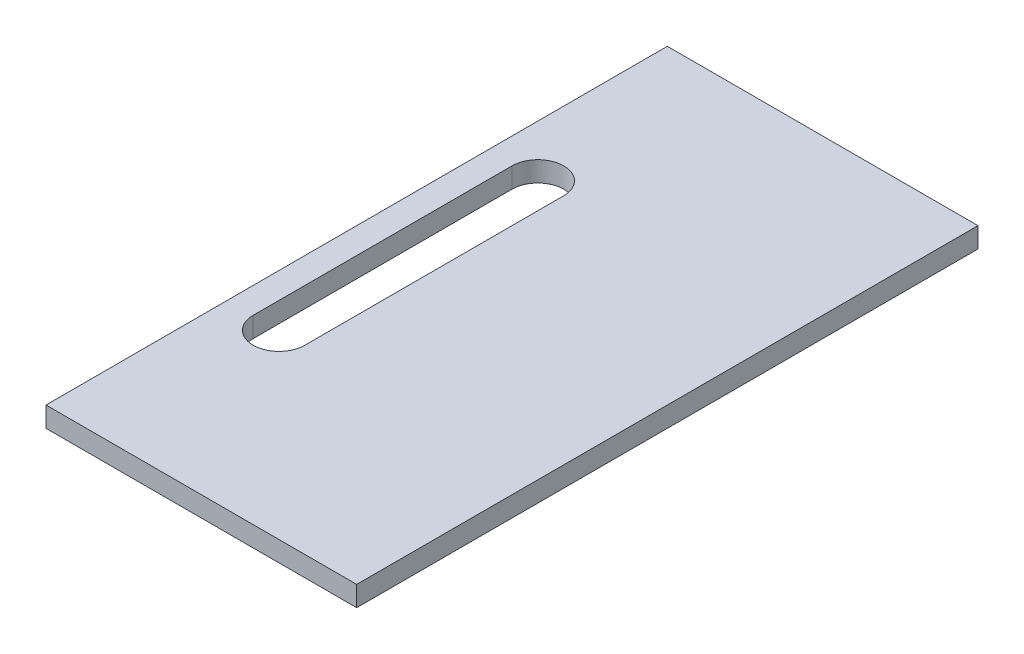
ISO-10303-21;
HEADER;
FILE_DESCRIPTION(('STEP AP214'),'2;1');
FILE_NAME('part.step','',(''),(''),'','','');
FILE_SCHEMA(('AUTOMOTIVE_DESIGN { 1 0 10303 214 1 1 1 1 }'));
ENDSEC;
DATA;
#1=APPLICATION_CONTEXT('core data for automotive mechanical design processes');
#2=APPLICATION_PROTOCOL_DEFINITION('international standard','automotive_design',2000,#1);
#3=PRODUCT_CONTEXT('',#1,'mechanical');
#4=PRODUCT('Part','Part','',(#3));
#5=PRODUCT_RELATED_PRODUCT_CATEGORY('part','',(#4));
#6=PRODUCT_DEFINITION_FORMATION('','',#4);
#7=PRODUCT_DEFINITION_CONTEXT('part definition',#1,'design');
#8=PRODUCT_DEFINITION('design','',#6,#7);
#9=PRODUCT_DEFINITION_SHAPE('','',#8);
#10=(LENGTH_UNIT() NAMED_UNIT(*) SI_UNIT(.MILLI.,.METRE.));
#11=(NAMED_UNIT(*) PLANE_ANGLE_UNIT() SI_UNIT($,.RADIAN.));
#12=(NAMED_UNIT(*) SI_UNIT($,.STERADIAN.) SOLID_ANGLE_UNIT());
#13=UNCERTAINTY_MEASURE_WITH_UNIT(LENGTH_MEASURE(1.E-05),#10,'distance_accuracy_value','');
#14=(GEOMETRIC_REPRESENTATION_CONTEXT(3) GLOBAL_UNCERTAINTY_ASSIGNED_CONTEXT((#13)) GLOBAL_UNIT_ASSIGNED_CONTEXT((#10,
#11,#12)) REPRESENTATION_CONTEXT('',''));
#15=CARTESIAN_POINT('',(0.,0.,0.));
#16=DIRECTION('',(0.,0.,1.));
#17=DIRECTION('',(1.,0.,0.));
#18=AXIS2_PLACEMENT_3D('',#15,#16,#17);
#19=CARTESIAN_POINT('',(0.,19.84375,0.));
#20=DIRECTION('',(1.,0.,0.));
#21=DIRECTION('',(0.,0.,-1.));
#22=AXIS2_PLACEMENT_3D('',#19,#20,#21);
#23=PLANE('',#22);
#24=DIRECTION('',(0.,0.,1.));
#25=VECTOR('',#24,1.);
#26=CARTESIAN_POINT('',(0.,0.,0.));
#27=LINE('',#26,#25);
#28=CARTESIAN_POINT('',(0.,0.,-609.6));
#29=VERTEX_POINT('',#28);
#30=CARTESIAN_POINT('',(0.,0.,0.));
#31=VERTEX_POINT('',#30);
#32=EDGE_CURVE('E134',#29,#31,#27,.T.);
#33=ORIENTED_EDGE('',*,*,#32,.T.);
#34=DIRECTION('',(0.,-1.,0.));
#35=VECTOR('',#34,1.);
#36=CARTESIAN_POINT('',(0.,19.84375,0.));
#37=LINE('',#36,#35);
#38=CARTESIAN_POINT('',(0.,19.84375,0.));
#39=VERTEX_POINT('',#38);
#40=EDGE_CURVE('E11',#39,#31,#37,.T.);
#41=ORIENTED_EDGE('',*,*,#40,.F.);
#42=DIRECTION('',(0.,0.,1.));
#43=VECTOR('',#42,1.);
#44=CARTESIAN_POINT('',(0.,19.84375,0.));
#45=LINE('',#44,#43);
#46=CARTESIAN_POINT('',(0.,19.84375,-609.6));
#47=VERTEX_POINT('',#46);
#48=EDGE_CURVE('E138',#47,#39,#45,.T.);
#49=ORIENTED_EDGE('',*,*,#48,.F.);
#50=DIRECTION('',(0.,-1.,0.));
#51=VECTOR('',#50,1.);
#52=CARTESIAN_POINT('',(0.,19.84375,-609.6));
#53=LINE('',#52,#51);
#54=EDGE_CURVE('E148',#47,#29,#53,.T.);
#55=ORIENTED_EDGE('',*,*,#54,.T.);
#56=EDGE_LOOP('',(#33,#41,#49,#55));
#57=FACE_BOUND('',#56,.T.);
#58=ADVANCED_FACE('F37',(#57),#23,.F.);
#59=CARTESIAN_POINT('',(0.,19.84375,0.));
#60=DIRECTION('',(0.,0.,-1.));
#61=DIRECTION('',(-1.,0.,0.));
#62=AXIS2_PLACEMENT_3D('',#59,#60,#61);
#63=PLANE('',#62);
#64=DIRECTION('',(1.,0.,0.));
#65=VECTOR('',#64,1.);
#66=CARTESIAN_POINT('',(0.,0.,0.));
#67=LINE('',#66,#65);
#68=CARTESIAN_POINT('',(304.8,0.,0.));
#69=VERTEX_POINT('',#68);
#70=EDGE_CURVE('E151',#31,#69,#67,.T.);
#71=ORIENTED_EDGE('',*,*,#70,.T.);
#72=DIRECTION('',(0.,-1.,0.));
#73=VECTOR('',#72,1.);
#74=CARTESIAN_POINT('',(304.8,19.84375,0.));
#75=LINE('',#74,#73);
#76=CARTESIAN_POINT('',(304.8,19.84375,0.));
#77=VERTEX_POINT('',#76);
#78=EDGE_CURVE('E44',#77,#69,#75,.T.);
#79=ORIENTED_EDGE('',*,*,#78,.F.);
#80=DIRECTION('',(1.,0.,0.));
#81=VECTOR('',#80,1.);
#82=CARTESIAN_POINT('',(0.,19.84375,0.));
#83=LINE('',#82,#81);
#84=EDGE_CURVE('E141',#39,#77,#83,.T.);
#85=ORIENTED_EDGE('',*,*,#84,.F.);
#86=ORIENTED_EDGE('',*,*,#40,.T.);
#87=EDGE_LOOP('',(#71,#79,#85,#86));
#88=FACE_BOUND('',#87,.T.);
#89=ADVANCED_FACE('F179',(#88),#63,.F.);
#90=CARTESIAN_POINT('',(304.8,19.84375,0.));
#91=DIRECTION('',(-1.,0.,0.));
#92=DIRECTION('',(0.,0.,1.));
#93=AXIS2_PLACEMENT_3D('',#90,#91,#92);
#94=PLANE('',#93);
#95=DIRECTION('',(0.,0.,-1.));
#96=VECTOR('',#95,1.);
#97=CARTESIAN_POINT('',(304.8,0.,0.));
#98=LINE('',#97,#96);
#99=CARTESIAN_POINT('',(304.8,0.,-609.6));
#100=VERTEX_POINT('',#99);
#101=EDGE_CURVE('E153',#69,#100,#98,.T.);
#102=ORIENTED_EDGE('',*,*,#101,.T.);
#103=DIRECTION('',(0.,-1.,0.));
#104=VECTOR('',#103,1.);
#105=CARTESIAN_POINT('',(304.8,19.84375,-609.6));
#106=LINE('',#105,#104);
#107=CARTESIAN_POINT('',(304.8,19.84375,-609.6));
#108=VERTEX_POINT('',#107);
#109=EDGE_CURVE('E158',#108,#100,#106,.T.);
#110=ORIENTED_EDGE('',*,*,#109,.F.);
#111=DIRECTION('',(0.,0.,-1.));
#112=VECTOR('',#111,1.);
#113=CARTESIAN_POINT('',(304.8,19.84375,0.));
#114=LINE('',#113,#112);
#115=EDGE_CURVE('E144',#77,#108,#114,.T.);
#116=ORIENTED_EDGE('',*,*,#115,.F.);
#117=ORIENTED_EDGE('',*,*,#78,.T.);
#118=EDGE_LOOP('',(#102,#110,#116,#117));
#119=FACE_BOUND('',#118,.T.);
#120=ADVANCED_FACE('F165',(#119),#94,.F.);
#121=CARTESIAN_POINT('',(0.,19.84375,-609.6));
#122=DIRECTION('',(0.,0.,1.));
#123=DIRECTION('',(1.,0.,0.));
#124=AXIS2_PLACEMENT_3D('',#121,#122,#123);
#125=PLANE('',#124);
#126=DIRECTION('',(-1.,0.,0.));
#127=VECTOR('',#126,1.);
#128=CARTESIAN_POINT('',(0.,0.,-609.6));
#129=LINE('',#128,#127);
#130=EDGE_CURVE('E142',#100,#29,#129,.T.);
#131=ORIENTED_EDGE('',*,*,#130,.T.);
#132=ORIENTED_EDGE('',*,*,#54,.F.);
#133=DIRECTION('',(-1.,0.,0.));
#134=VECTOR('',#133,1.);
#135=CARTESIAN_POINT('',(0.,19.84375,-609.6));
#136=LINE('',#135,#134);
#137=EDGE_CURVE('E146',#108,#47,#136,.T.);
#138=ORIENTED_EDGE('',*,*,#137,.F.);
#139=ORIENTED_EDGE('',*,*,#109,.T.);
#140=EDGE_LOOP('',(#131,#132,#138,#139));
#141=FACE_BOUND('',#140,.T.);
#142=ADVANCED_FACE('F172',(#141),#125,.F.);
#143=CARTESIAN_POINT('',(0.,19.84375,0.));
#144=DIRECTION('',(0.,-1.,0.));
#145=DIRECTION('',(0.,0.,-1.));
#146=AXIS2_PLACEMENT_3D('',#143,#144,#145);
#147=PLANE('',#146);
#148=DIRECTION('',(0.,0.,1.));
#149=VECTOR('',#148,1.);
#150=CARTESIAN_POINT('',(25.3999999999999,19.84375,-431.8));
#151=LINE('',#150,#149);
#152=CARTESIAN_POINT('',(25.3999999999999,19.84375,-431.8));
#153=VERTEX_POINT('',#152);
#154=CARTESIAN_POINT('',(25.3999999999999,19.84375,-177.8));
#155=VERTEX_POINT('',#154);
#156=EDGE_CURVE('E128',#153,#155,#151,.T.);
#157=ORIENTED_EDGE('',*,*,#156,.F.);
#158=CARTESIAN_POINT('',(50.7999999999999,19.84375,-431.8));
#159=DIRECTION('',(0.,1.,0.));
#160=DIRECTION('',(0.,0.,1.));
#161=AXIS2_PLACEMENT_3D('',#158,#159,#160);
#162=CIRCLE('',#161,25.4);
#163=CARTESIAN_POINT('',(76.2,19.84375,-431.8));
#164=VERTEX_POINT('',#163);
#165=EDGE_CURVE('E51',#164,#153,#162,.T.);
#166=ORIENTED_EDGE('',*,*,#165,.F.);
#167=DIRECTION('',(0.,0.,-1.));
#168=VECTOR('',#167,1.);
#169=CARTESIAN_POINT('',(76.2,19.84375,-431.8));
#170=LINE('',#169,#168);
#171=CARTESIAN_POINT('',(76.2,19.84375,-177.8));
#172=VERTEX_POINT('',#171);
#173=EDGE_CURVE('E119',#172,#164,#170,.T.);
#174=ORIENTED_EDGE('',*,*,#173,.F.);
#175=CARTESIAN_POINT('',(50.7999999999999,19.84375,-177.8));
#176=DIRECTION('',(0.,1.,0.));
#177=DIRECTION('',(0.,0.,1.));
#178=AXIS2_PLACEMENT_3D('',#175,#176,#177);
#179=CIRCLE('',#178,25.4);
#180=EDGE_CURVE('E122',#155,#172,#179,.T.);
#181=ORIENTED_EDGE('',*,*,#180,.F.);
#182=EDGE_LOOP('',(#157,#166,#174,#181));
#183=FACE_BOUND('',#182,.T.);
#184=ORIENTED_EDGE('',*,*,#48,.T.);
#185=ORIENTED_EDGE('',*,*,#84,.T.);
#186=ORIENTED_EDGE('',*,*,#115,.T.);
#187=ORIENTED_EDGE('',*,*,#137,.T.);
#188=EDGE_LOOP('',(#184,#185,#186,#187));
#189=FACE_BOUND('',#188,.T.);
#190=ADVANCED_FACE('F178',(#183,#189),#147,.F.);
#191=CARTESIAN_POINT('',(0.,0.,0.));
#192=DIRECTION('',(0.,-1.,0.));
#193=DIRECTION('',(0.,0.,-1.));
#194=AXIS2_PLACEMENT_3D('',#191,#192,#193);
#195=PLANE('',#194);
#196=CARTESIAN_POINT('',(50.7999999999999,0.,-431.8));
#197=DIRECTION('',(0.,1.,0.));
#198=DIRECTION('',(0.,0.,1.));
#199=AXIS2_PLACEMENT_3D('',#196,#197,#198);
#200=CIRCLE('',#199,25.4);
#201=CARTESIAN_POINT('',(76.2,0.,-431.8));
#202=VERTEX_POINT('',#201);
#203=CARTESIAN_POINT('',(25.3999999999999,0.,-431.8));
#204=VERTEX_POINT('',#203);
#205=EDGE_CURVE('E103',#202,#204,#200,.T.);
#206=ORIENTED_EDGE('',*,*,#205,.T.);
#207=DIRECTION('',(0.,0.,1.));
#208=VECTOR('',#207,1.);
#209=CARTESIAN_POINT('',(25.3999999999999,0.,-431.8));
#210=LINE('',#209,#208);
#211=CARTESIAN_POINT('',(25.3999999999999,0.,-177.8));
#212=VERTEX_POINT('',#211);
#213=EDGE_CURVE('E112',#204,#212,#210,.T.);
#214=ORIENTED_EDGE('',*,*,#213,.T.);
#215=CARTESIAN_POINT('',(50.7999999999999,0.,-177.8));
#216=DIRECTION('',(0.,1.,0.));
#217=DIRECTION('',(0.,0.,1.));
#218=AXIS2_PLACEMENT_3D('',#215,#216,#217);
#219=CIRCLE('',#218,25.4);
#220=CARTESIAN_POINT('',(76.2,0.,-177.8));
#221=VERTEX_POINT('',#220);
#222=EDGE_CURVE('E59',#212,#221,#219,.T.);
#223=ORIENTED_EDGE('',*,*,#222,.T.);
#224=DIRECTION('',(0.,0.,-1.));
#225=VECTOR('',#224,1.);
#226=CARTESIAN_POINT('',(76.2,0.,-431.8));
#227=LINE('',#226,#225);
#228=EDGE_CURVE('E109',#221,#202,#227,.T.);
#229=ORIENTED_EDGE('',*,*,#228,.T.);
#230=EDGE_LOOP('',(#206,#214,#223,#229));
#231=FACE_BOUND('',#230,.T.);
#232=ORIENTED_EDGE('',*,*,#32,.F.);
#233=ORIENTED_EDGE('',*,*,#130,.F.);
#234=ORIENTED_EDGE('',*,*,#101,.F.);
#235=ORIENTED_EDGE('',*,*,#70,.F.);
#236=EDGE_LOOP('',(#232,#233,#234,#235));
#237=FACE_BOUND('',#236,.T.);
#238=ADVANCED_FACE('F116',(#231,#237),#195,.T.);
#239=CARTESIAN_POINT('',(50.7999999999999,0.,-431.8));
#240=DIRECTION('',(0.,1.,0.));
#241=DIRECTION('',(0.,0.,1.));
#242=AXIS2_PLACEMENT_3D('',#239,#240,#241);
#243=CYLINDRICAL_SURFACE('',#242,25.4);
#244=ORIENTED_EDGE('',*,*,#165,.T.);
#245=DIRECTION('',(0.,1.,0.));
#246=VECTOR('',#245,1.);
#247=CARTESIAN_POINT('',(25.3999999999999,0.,-431.8));
#248=LINE('',#247,#246);
#249=EDGE_CURVE('E99',#204,#153,#248,.T.);
#250=ORIENTED_EDGE('',*,*,#249,.F.);
#251=ORIENTED_EDGE('',*,*,#205,.F.);
#252=DIRECTION('',(0.,1.,0.));
#253=VECTOR('',#252,1.);
#254=CARTESIAN_POINT('',(76.2,0.,-431.8));
#255=LINE('',#254,#253);
#256=EDGE_CURVE('E132',#202,#164,#255,.T.);
#257=ORIENTED_EDGE('',*,*,#256,.T.);
#258=EDGE_LOOP('',(#244,#250,#251,#257));
#259=FACE_BOUND('',#258,.T.);
#260=ADVANCED_FACE('F101',(#259),#243,.F.);
#261=CARTESIAN_POINT('',(76.2,0.,-431.8));
#262=DIRECTION('',(1.,0.,0.));
#263=DIRECTION('',(0.,0.,-1.));
#264=AXIS2_PLACEMENT_3D('',#261,#262,#263);
#265=PLANE('',#264);
#266=ORIENTED_EDGE('',*,*,#173,.T.);
#267=ORIENTED_EDGE('',*,*,#256,.F.);
#268=ORIENTED_EDGE('',*,*,#228,.F.);
#269=DIRECTION('',(0.,1.,0.));
#270=VECTOR('',#269,1.);
#271=CARTESIAN_POINT('',(76.2,0.,-177.8));
#272=LINE('',#271,#270);
#273=EDGE_CURVE('E135',#221,#172,#272,.T.);
#274=ORIENTED_EDGE('',*,*,#273,.T.);
#275=EDGE_LOOP('',(#266,#267,#268,#274));
#276=FACE_BOUND('',#275,.T.);
#277=ADVANCED_FACE('F196',(#276),#265,.F.);
#278=CARTESIAN_POINT('',(50.7999999999999,0.,-177.8));
#279=DIRECTION('',(0.,1.,0.));
#280=DIRECTION('',(0.,0.,1.));
#281=AXIS2_PLACEMENT_3D('',#278,#279,#280);
#282=CYLINDRICAL_SURFACE('',#281,25.4);
#283=ORIENTED_EDGE('',*,*,#180,.T.);
#284=ORIENTED_EDGE('',*,*,#273,.F.);
#285=ORIENTED_EDGE('',*,*,#222,.F.);
#286=DIRECTION('',(0.,1.,0.));
#287=VECTOR('',#286,1.);
#288=CARTESIAN_POINT('',(25.3999999999999,0.,-177.8));
#289=LINE('',#288,#287);
#290=EDGE_CURVE('E108',#212,#155,#289,.T.);
#291=ORIENTED_EDGE('',*,*,#290,.T.);
#292=EDGE_LOOP('',(#283,#284,#285,#291));
#293=FACE_BOUND('',#292,.T.);
#294=ADVANCED_FACE('F199',(#293),#282,.F.);
#295=CARTESIAN_POINT('',(25.3999999999999,0.,-431.8));
#296=DIRECTION('',(-1.,0.,0.));
#297=DIRECTION('',(0.,0.,1.));
#298=AXIS2_PLACEMENT_3D('',#295,#296,#297);
#299=PLANE('',#298);
#300=ORIENTED_EDGE('',*,*,#156,.T.);
#301=ORIENTED_EDGE('',*,*,#290,.F.);
#302=ORIENTED_EDGE('',*,*,#213,.F.);
#303=ORIENTED_EDGE('',*,*,#249,.T.);
#304=EDGE_LOOP('',(#300,#301,#302,#303));
#305=FACE_BOUND('',#304,.T.);
#306=ADVANCED_FACE('F113',(#305),#299,.F.);
#307=CLOSED_SHELL('',(#58,#89,#120,#142,#190,#238,#260,#277,#294,#306));
#308=MANIFOLD_SOLID_BREP('B2',#307);
#309=ADVANCED_BREP_SHAPE_REPRESENTATION('',(#18,#308),#14);
#310=SHAPE_DEFINITION_REPRESENTATION(#9,#309);
ENDSEC;
END-ISO-10303-21;
